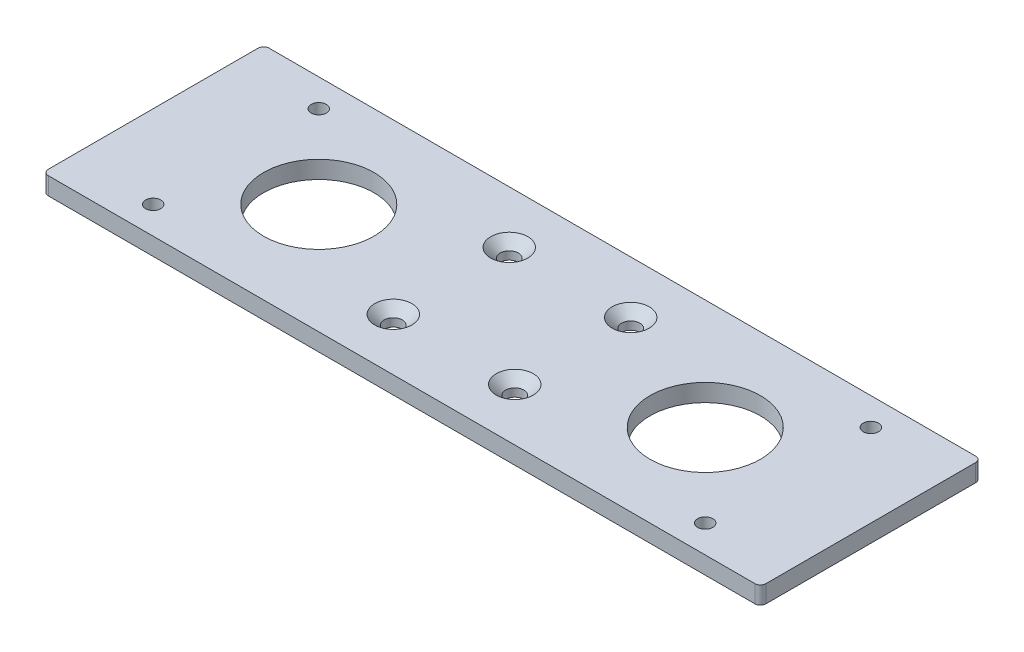
ISO-10303-21;
HEADER;
FILE_DESCRIPTION(('STEP AP214'),'2;1');
FILE_NAME('part.step','',(''),(''),'','','');
FILE_SCHEMA(('AUTOMOTIVE_DESIGN { 1 0 10303 214 1 1 1 1 }'));
ENDSEC;
DATA;
#1=APPLICATION_CONTEXT('core data for automotive mechanical design processes');
#2=APPLICATION_PROTOCOL_DEFINITION('international standard','automotive_design',2000,#1);
#3=PRODUCT_CONTEXT('',#1,'mechanical');
#4=PRODUCT('Part','Part','',(#3));
#5=PRODUCT_RELATED_PRODUCT_CATEGORY('part','',(#4));
#6=PRODUCT_DEFINITION_FORMATION('','',#4);
#7=PRODUCT_DEFINITION_CONTEXT('part definition',#1,'design');
#8=PRODUCT_DEFINITION('design','',#6,#7);
#9=PRODUCT_DEFINITION_SHAPE('','',#8);
#10=(LENGTH_UNIT() NAMED_UNIT(*) SI_UNIT(.MILLI.,.METRE.));
#11=(NAMED_UNIT(*) PLANE_ANGLE_UNIT() SI_UNIT($,.RADIAN.));
#12=(NAMED_UNIT(*) SI_UNIT($,.STERADIAN.) SOLID_ANGLE_UNIT());
#13=UNCERTAINTY_MEASURE_WITH_UNIT(LENGTH_MEASURE(1.E-05),#10,'distance_accuracy_value','');
#14=(GEOMETRIC_REPRESENTATION_CONTEXT(3) GLOBAL_UNCERTAINTY_ASSIGNED_CONTEXT((#13)) GLOBAL_UNIT_ASSIGNED_CONTEXT((#10,
#11,#12)) REPRESENTATION_CONTEXT('',''));
#15=CARTESIAN_POINT('',(0.,0.,0.));
#16=DIRECTION('',(0.,0.,1.));
#17=DIRECTION('',(1.,0.,0.));
#18=AXIS2_PLACEMENT_3D('',#15,#16,#17);
#19=CARTESIAN_POINT('',(-149.777777777778,-6.35,-34.4444444444445));
#20=DIRECTION('',(-1.,0.,0.));
#21=DIRECTION('',(0.,0.,1.));
#22=AXIS2_PLACEMENT_3D('',#19,#20,#21);
#23=PLANE('',#22);
#24=DIRECTION('',(0.,0.,1.));
#25=VECTOR('',#24,1.);
#26=CARTESIAN_POINT('',(-149.777777777778,0.,-34.4444444444445));
#27=LINE('',#26,#25);
#28=CARTESIAN_POINT('',(-149.777777777778,0.,-32.4444444444445));
#29=VERTEX_POINT('',#28);
#30=CARTESIAN_POINT('',(-149.777777777778,0.,43.5555555555555));
#31=VERTEX_POINT('',#30);
#32=EDGE_CURVE('E166',#29,#31,#27,.T.);
#33=ORIENTED_EDGE('',*,*,#32,.F.);
#34=DIRECTION('',(0.,1.,0.));
#35=VECTOR('',#34,1.);
#36=CARTESIAN_POINT('',(-149.777777777778,-6.35,-32.4444444444445));
#37=LINE('',#36,#35);
#38=CARTESIAN_POINT('',(-149.777777777778,-6.35,-32.4444444444445));
#39=VERTEX_POINT('',#38);
#40=EDGE_CURVE('E146',#29,#39,#37,.F.);
#41=ORIENTED_EDGE('',*,*,#40,.T.);
#42=DIRECTION('',(0.,0.,1.));
#43=VECTOR('',#42,1.);
#44=CARTESIAN_POINT('',(-149.777777777778,-6.35,-34.4444444444445));
#45=LINE('',#44,#43);
#46=CARTESIAN_POINT('',(-149.777777777778,-6.35,43.5555555555555));
#47=VERTEX_POINT('',#46);
#48=EDGE_CURVE('E127',#39,#47,#45,.T.);
#49=ORIENTED_EDGE('',*,*,#48,.T.);
#50=DIRECTION('',(0.,1.,0.));
#51=VECTOR('',#50,1.);
#52=CARTESIAN_POINT('',(-149.777777777778,-6.35,43.5555555555555));
#53=LINE('',#52,#51);
#54=EDGE_CURVE('E143',#47,#31,#53,.T.);
#55=ORIENTED_EDGE('',*,*,#54,.T.);
#56=EDGE_LOOP('',(#33,#41,#49,#55));
#57=FACE_BOUND('',#56,.T.);
#58=ADVANCED_FACE('F40',(#57),#23,.T.);
#59=CARTESIAN_POINT('',(-149.777777777778,-6.35,-34.4444444444445));
#60=DIRECTION('',(0.,0.,-1.));
#61=DIRECTION('',(-1.,0.,0.));
#62=AXIS2_PLACEMENT_3D('',#59,#60,#61);
#63=PLANE('',#62);
#64=DIRECTION('',(-1.,0.,0.));
#65=VECTOR('',#64,1.);
#66=CARTESIAN_POINT('',(-149.777777777778,-6.35,-34.4444444444445));
#67=LINE('',#66,#65);
#68=CARTESIAN_POINT('',(108.222222222222,-6.35,-34.4444444444445));
#69=VERTEX_POINT('',#68);
#70=CARTESIAN_POINT('',(-147.777777777778,-6.35,-34.4444444444445));
#71=VERTEX_POINT('',#70);
#72=EDGE_CURVE('E132',#69,#71,#67,.T.);
#73=ORIENTED_EDGE('',*,*,#72,.T.);
#74=DIRECTION('',(0.,1.,0.));
#75=VECTOR('',#74,1.);
#76=CARTESIAN_POINT('',(-147.777777777778,-6.35,-34.4444444444445));
#77=LINE('',#76,#75);
#78=CARTESIAN_POINT('',(-147.777777777778,0.,-34.4444444444445));
#79=VERTEX_POINT('',#78);
#80=EDGE_CURVE('E126',#71,#79,#77,.T.);
#81=ORIENTED_EDGE('',*,*,#80,.T.);
#82=DIRECTION('',(-1.,0.,0.));
#83=VECTOR('',#82,1.);
#84=CARTESIAN_POINT('',(-149.777777777778,0.,-34.4444444444445));
#85=LINE('',#84,#83);
#86=CARTESIAN_POINT('',(108.222222222222,0.,-34.4444444444445));
#87=VERTEX_POINT('',#86);
#88=EDGE_CURVE('E109',#87,#79,#85,.T.);
#89=ORIENTED_EDGE('',*,*,#88,.F.);
#90=DIRECTION('',(0.,1.,0.));
#91=VECTOR('',#90,1.);
#92=CARTESIAN_POINT('',(108.222222222222,-6.35,-34.4444444444445));
#93=LINE('',#92,#91);
#94=EDGE_CURVE('E123',#87,#69,#93,.F.);
#95=ORIENTED_EDGE('',*,*,#94,.T.);
#96=EDGE_LOOP('',(#73,#81,#89,#95));
#97=FACE_BOUND('',#96,.T.);
#98=ADVANCED_FACE('F122',(#97),#63,.T.);
#99=CARTESIAN_POINT('',(110.222222222222,-6.35,-34.4444444444445));
#100=DIRECTION('',(1.,0.,0.));
#101=DIRECTION('',(0.,0.,-1.));
#102=AXIS2_PLACEMENT_3D('',#99,#100,#101);
#103=PLANE('',#102);
#104=DIRECTION('',(0.,0.,-1.));
#105=VECTOR('',#104,1.);
#106=CARTESIAN_POINT('',(110.222222222222,-6.35,-34.4444444444445));
#107=LINE('',#106,#105);
#108=CARTESIAN_POINT('',(110.222222222222,-6.35,43.5555555555555));
#109=VERTEX_POINT('',#108);
#110=CARTESIAN_POINT('',(110.222222222222,-6.35,-32.4444444444445));
#111=VERTEX_POINT('',#110);
#112=EDGE_CURVE('E136',#109,#111,#107,.T.);
#113=ORIENTED_EDGE('',*,*,#112,.T.);
#114=DIRECTION('',(0.,1.,0.));
#115=VECTOR('',#114,1.);
#116=CARTESIAN_POINT('',(110.222222222222,-6.35,-32.4444444444445));
#117=LINE('',#116,#115);
#118=CARTESIAN_POINT('',(110.222222222222,0.,-32.4444444444445));
#119=VERTEX_POINT('',#118);
#120=EDGE_CURVE('E156',#111,#119,#117,.T.);
#121=ORIENTED_EDGE('',*,*,#120,.T.);
#122=DIRECTION('',(0.,0.,-1.));
#123=VECTOR('',#122,1.);
#124=CARTESIAN_POINT('',(110.222222222222,0.,-34.4444444444445));
#125=LINE('',#124,#123);
#126=CARTESIAN_POINT('',(110.222222222222,0.,43.5555555555555));
#127=VERTEX_POINT('',#126);
#128=EDGE_CURVE('E111',#127,#119,#125,.T.);
#129=ORIENTED_EDGE('',*,*,#128,.F.);
#130=DIRECTION('',(0.,1.,0.));
#131=VECTOR('',#130,1.);
#132=CARTESIAN_POINT('',(110.222222222222,-6.35,43.5555555555555));
#133=LINE('',#132,#131);
#134=EDGE_CURVE('E154',#127,#109,#133,.F.);
#135=ORIENTED_EDGE('',*,*,#134,.T.);
#136=EDGE_LOOP('',(#113,#121,#129,#135));
#137=FACE_BOUND('',#136,.T.);
#138=ADVANCED_FACE('F159',(#137),#103,.T.);
#139=CARTESIAN_POINT('',(-149.777777777778,-6.35,45.5555555555555));
#140=DIRECTION('',(0.,0.,1.));
#141=DIRECTION('',(1.,0.,0.));
#142=AXIS2_PLACEMENT_3D('',#139,#140,#141);
#143=PLANE('',#142);
#144=DIRECTION('',(1.,0.,0.));
#145=VECTOR('',#144,1.);
#146=CARTESIAN_POINT('',(-149.777777777778,-6.35,45.5555555555555));
#147=LINE('',#146,#145);
#148=CARTESIAN_POINT('',(-147.777777777778,-6.35,45.5555555555555));
#149=VERTEX_POINT('',#148);
#150=CARTESIAN_POINT('',(108.222222222222,-6.35,45.5555555555555));
#151=VERTEX_POINT('',#150);
#152=EDGE_CURVE('E161',#149,#151,#147,.T.);
#153=ORIENTED_EDGE('',*,*,#152,.T.);
#154=DIRECTION('',(0.,1.,0.));
#155=VECTOR('',#154,1.);
#156=CARTESIAN_POINT('',(108.222222222222,-6.35,45.5555555555555));
#157=LINE('',#156,#155);
#158=CARTESIAN_POINT('',(108.222222222222,0.,45.5555555555555));
#159=VERTEX_POINT('',#158);
#160=EDGE_CURVE('E11',#151,#159,#157,.T.);
#161=ORIENTED_EDGE('',*,*,#160,.T.);
#162=DIRECTION('',(1.,0.,0.));
#163=VECTOR('',#162,1.);
#164=CARTESIAN_POINT('',(-149.777777777778,0.,45.5555555555555));
#165=LINE('',#164,#163);
#166=CARTESIAN_POINT('',(-147.777777777778,0.,45.5555555555555));
#167=VERTEX_POINT('',#166);
#168=EDGE_CURVE('E169',#167,#159,#165,.T.);
#169=ORIENTED_EDGE('',*,*,#168,.F.);
#170=DIRECTION('',(0.,1.,0.));
#171=VECTOR('',#170,1.);
#172=CARTESIAN_POINT('',(-147.777777777778,-6.35,45.5555555555555));
#173=LINE('',#172,#171);
#174=EDGE_CURVE('E48',#167,#149,#173,.F.);
#175=ORIENTED_EDGE('',*,*,#174,.T.);
#176=EDGE_LOOP('',(#153,#161,#169,#175));
#177=FACE_BOUND('',#176,.T.);
#178=ADVANCED_FACE('F172',(#177),#143,.T.);
#179=CARTESIAN_POINT('',(0.,-6.35,0.));
#180=DIRECTION('',(0.,1.,0.));
#181=DIRECTION('',(0.,0.,1.));
#182=AXIS2_PLACEMENT_3D('',#179,#180,#181);
#183=PLANE('',#182);
#184=CARTESIAN_POINT('',(50.2222222222223,-6.35,5.55555555555558));
#185=DIRECTION('',(0.,1.,0.));
#186=DIRECTION('',(0.,0.,1.));
#187=AXIS2_PLACEMENT_3D('',#184,#185,#186);
#188=CIRCLE('',#187,20.);
#189=CARTESIAN_POINT('',(50.2222222222223,-6.35,25.5555555555556));
#190=VERTEX_POINT('',#189);
#191=EDGE_CURVE('E250',#190,#190,#188,.T.);
#192=ORIENTED_EDGE('',*,*,#191,.T.);
#193=EDGE_LOOP('',(#192));
#194=FACE_BOUND('',#193,.T.);
#195=CARTESIAN_POINT('',(-89.7777777777778,-6.35,5.55555555555557));
#196=DIRECTION('',(0.,1.,0.));
#197=DIRECTION('',(0.,0.,1.));
#198=AXIS2_PLACEMENT_3D('',#195,#196,#197);
#199=CIRCLE('',#198,20.);
#200=CARTESIAN_POINT('',(-89.7777777777778,-6.35,25.5555555555556));
#201=VERTEX_POINT('',#200);
#202=EDGE_CURVE('E244',#201,#201,#199,.T.);
#203=ORIENTED_EDGE('',*,*,#202,.T.);
#204=EDGE_LOOP('',(#203));
#205=FACE_BOUND('',#204,.T.);
#206=CARTESIAN_POINT('',(-41.7777777777778,-6.35,-15.4444444444444));
#207=DIRECTION('',(0.,1.,0.));
#208=DIRECTION('',(0.,0.,1.));
#209=AXIS2_PLACEMENT_3D('',#206,#207,#208);
#210=CIRCLE('',#209,3.3);
#211=CARTESIAN_POINT('',(-41.7777777777778,-6.35,-12.1444444444444));
#212=VERTEX_POINT('',#211);
#213=EDGE_CURVE('E235',#212,#212,#210,.T.);
#214=ORIENTED_EDGE('',*,*,#213,.T.);
#215=EDGE_LOOP('',(#214));
#216=FACE_BOUND('',#215,.T.);
#217=CARTESIAN_POINT('',(2.22222222222224,-6.35,-15.4444444444444));
#218=DIRECTION('',(0.,1.,0.));
#219=DIRECTION('',(0.,0.,1.));
#220=AXIS2_PLACEMENT_3D('',#217,#218,#219);
#221=CIRCLE('',#220,3.3);
#222=CARTESIAN_POINT('',(2.22222222222224,-6.35,-12.1444444444444));
#223=VERTEX_POINT('',#222);
#224=EDGE_CURVE('E226',#223,#223,#221,.T.);
#225=ORIENTED_EDGE('',*,*,#224,.T.);
#226=EDGE_LOOP('',(#225));
#227=FACE_BOUND('',#226,.T.);
#228=CARTESIAN_POINT('',(2.22222222222224,-6.35,26.5555555555556));
#229=DIRECTION('',(0.,1.,0.));
#230=DIRECTION('',(0.,0.,1.));
#231=AXIS2_PLACEMENT_3D('',#228,#229,#230);
#232=CIRCLE('',#231,3.3);
#233=CARTESIAN_POINT('',(2.22222222222224,-6.35,29.8555555555556));
#234=VERTEX_POINT('',#233);
#235=EDGE_CURVE('E217',#234,#234,#232,.T.);
#236=ORIENTED_EDGE('',*,*,#235,.T.);
#237=EDGE_LOOP('',(#236));
#238=FACE_BOUND('',#237,.T.);
#239=CARTESIAN_POINT('',(-41.7777777777778,-6.35,26.5555555555556));
#240=DIRECTION('',(0.,1.,0.));
#241=DIRECTION('',(0.,0.,1.));
#242=AXIS2_PLACEMENT_3D('',#239,#240,#241);
#243=CIRCLE('',#242,3.3);
#244=CARTESIAN_POINT('',(-41.7777777777778,-6.35,29.8555555555556));
#245=VERTEX_POINT('',#244);
#246=EDGE_CURVE('E208',#245,#245,#243,.T.);
#247=ORIENTED_EDGE('',*,*,#246,.T.);
#248=EDGE_LOOP('',(#247));
#249=FACE_BOUND('',#248,.T.);
#250=CARTESIAN_POINT('',(-119.777777777778,-6.35,-24.4444444444445));
#251=DIRECTION('',(0.,1.,0.));
#252=DIRECTION('',(0.,0.,1.));
#253=AXIS2_PLACEMENT_3D('',#250,#251,#252);
#254=CIRCLE('',#253,2.75);
#255=CARTESIAN_POINT('',(-119.777777777778,-6.35,-21.6944444444445));
#256=VERTEX_POINT('',#255);
#257=EDGE_CURVE('E202',#256,#256,#254,.T.);
#258=ORIENTED_EDGE('',*,*,#257,.T.);
#259=EDGE_LOOP('',(#258));
#260=FACE_BOUND('',#259,.T.);
#261=CARTESIAN_POINT('',(-119.777777777778,-6.35,35.5555555555555));
#262=DIRECTION('',(0.,1.,0.));
#263=DIRECTION('',(0.,0.,1.));
#264=AXIS2_PLACEMENT_3D('',#261,#262,#263);
#265=CIRCLE('',#264,2.75);
#266=CARTESIAN_POINT('',(-119.777777777778,-6.35,38.3055555555555));
#267=VERTEX_POINT('',#266);
#268=EDGE_CURVE('E196',#267,#267,#265,.T.);
#269=ORIENTED_EDGE('',*,*,#268,.T.);
#270=EDGE_LOOP('',(#269));
#271=FACE_BOUND('',#270,.T.);
#272=CARTESIAN_POINT('',(80.2222222222223,-6.35,35.5555555555555));
#273=DIRECTION('',(0.,1.,0.));
#274=DIRECTION('',(0.,0.,1.));
#275=AXIS2_PLACEMENT_3D('',#272,#273,#274);
#276=CIRCLE('',#275,2.75);
#277=CARTESIAN_POINT('',(80.2222222222223,-6.35,38.3055555555555));
#278=VERTEX_POINT('',#277);
#279=EDGE_CURVE('E190',#278,#278,#276,.T.);
#280=ORIENTED_EDGE('',*,*,#279,.T.);
#281=EDGE_LOOP('',(#280));
#282=FACE_BOUND('',#281,.T.);
#283=CARTESIAN_POINT('',(80.2222222222223,-6.35,-24.4444444444445));
#284=DIRECTION('',(0.,1.,0.));
#285=DIRECTION('',(0.,0.,1.));
#286=AXIS2_PLACEMENT_3D('',#283,#284,#285);
#287=CIRCLE('',#286,2.75);
#288=CARTESIAN_POINT('',(80.2222222222223,-6.35,-21.6944444444445));
#289=VERTEX_POINT('',#288);
#290=EDGE_CURVE('E170',#289,#289,#287,.T.);
#291=ORIENTED_EDGE('',*,*,#290,.T.);
#292=EDGE_LOOP('',(#291));
#293=FACE_BOUND('',#292,.T.);
#294=ORIENTED_EDGE('',*,*,#48,.F.);
#295=CARTESIAN_POINT('',(-147.777777777778,-6.35,-32.4444444444445));
#296=DIRECTION('',(0.,1.,0.));
#297=DIRECTION('',(0.,0.,1.));
#298=AXIS2_PLACEMENT_3D('',#295,#296,#297);
#299=CIRCLE('',#298,2.);
#300=EDGE_CURVE('E152',#39,#71,#299,.F.);
#301=ORIENTED_EDGE('',*,*,#300,.T.);
#302=ORIENTED_EDGE('',*,*,#72,.F.);
#303=CARTESIAN_POINT('',(108.222222222222,-6.35,-32.4444444444445));
#304=DIRECTION('',(0.,1.,0.));
#305=DIRECTION('',(0.,0.,1.));
#306=AXIS2_PLACEMENT_3D('',#303,#304,#305);
#307=CIRCLE('',#306,2.);
#308=EDGE_CURVE('E131',#69,#111,#307,.F.);
#309=ORIENTED_EDGE('',*,*,#308,.T.);
#310=ORIENTED_EDGE('',*,*,#112,.F.);
#311=CARTESIAN_POINT('',(108.222222222222,-6.35,43.5555555555555));
#312=DIRECTION('',(0.,1.,0.));
#313=DIRECTION('',(0.,0.,1.));
#314=AXIS2_PLACEMENT_3D('',#311,#312,#313);
#315=CIRCLE('',#314,2.);
#316=EDGE_CURVE('E55',#109,#151,#315,.F.);
#317=ORIENTED_EDGE('',*,*,#316,.T.);
#318=ORIENTED_EDGE('',*,*,#152,.F.);
#319=CARTESIAN_POINT('',(-147.777777777778,-6.35,43.5555555555555));
#320=DIRECTION('',(0.,1.,0.));
#321=DIRECTION('',(0.,0.,1.));
#322=AXIS2_PLACEMENT_3D('',#319,#320,#321);
#323=CIRCLE('',#322,2.);
#324=EDGE_CURVE('E148',#149,#47,#323,.F.);
#325=ORIENTED_EDGE('',*,*,#324,.T.);
#326=EDGE_LOOP('',(#294,#301,#302,#309,#310,#317,#318,#325));
#327=FACE_BOUND('',#326,.T.);
#328=ADVANCED_FACE('F179',(#194,#205,#216,#227,#238,#249,#260,#271,#282,#293,#327),#183,.F.);
#329=CARTESIAN_POINT('',(0.,0.,0.));
#330=DIRECTION('',(0.,1.,0.));
#331=DIRECTION('',(0.,0.,1.));
#332=AXIS2_PLACEMENT_3D('',#329,#330,#331);
#333=PLANE('',#332);
#334=CARTESIAN_POINT('',(50.2222222222223,0.,5.55555555555558));
#335=DIRECTION('',(0.,1.,0.));
#336=DIRECTION('',(0.,0.,1.));
#337=AXIS2_PLACEMENT_3D('',#334,#335,#336);
#338=CIRCLE('',#337,20.);
#339=CARTESIAN_POINT('',(50.2222222222223,0.,25.5555555555556));
#340=VERTEX_POINT('',#339);
#341=EDGE_CURVE('E253',#340,#340,#338,.T.);
#342=ORIENTED_EDGE('',*,*,#341,.F.);
#343=EDGE_LOOP('',(#342));
#344=FACE_BOUND('',#343,.T.);
#345=CARTESIAN_POINT('',(-89.7777777777778,0.,5.55555555555557));
#346=DIRECTION('',(0.,1.,0.));
#347=DIRECTION('',(0.,0.,1.));
#348=AXIS2_PLACEMENT_3D('',#345,#346,#347);
#349=CIRCLE('',#348,20.);
#350=CARTESIAN_POINT('',(-89.7777777777778,0.,25.5555555555556));
#351=VERTEX_POINT('',#350);
#352=EDGE_CURVE('E247',#351,#351,#349,.T.);
#353=ORIENTED_EDGE('',*,*,#352,.F.);
#354=EDGE_LOOP('',(#353));
#355=FACE_BOUND('',#354,.T.);
#356=CARTESIAN_POINT('',(-41.7777777777778,0.,-15.4444444444444));
#357=DIRECTION('',(0.,1.,0.));
#358=DIRECTION('',(0.,0.,1.));
#359=AXIS2_PLACEMENT_3D('',#356,#357,#358);
#360=CIRCLE('',#359,6.72);
#361=CARTESIAN_POINT('',(-41.7777777777778,0.,-8.72444444444442));
#362=VERTEX_POINT('',#361);
#363=EDGE_CURVE('E241',#362,#362,#360,.T.);
#364=ORIENTED_EDGE('',*,*,#363,.F.);
#365=EDGE_LOOP('',(#364));
#366=FACE_BOUND('',#365,.T.);
#367=CARTESIAN_POINT('',(2.22222222222224,0.,-15.4444444444444));
#368=DIRECTION('',(0.,1.,0.));
#369=DIRECTION('',(0.,0.,1.));
#370=AXIS2_PLACEMENT_3D('',#367,#368,#369);
#371=CIRCLE('',#370,6.72);
#372=CARTESIAN_POINT('',(2.22222222222224,0.,-8.72444444444443));
#373=VERTEX_POINT('',#372);
#374=EDGE_CURVE('E232',#373,#373,#371,.T.);
#375=ORIENTED_EDGE('',*,*,#374,.F.);
#376=EDGE_LOOP('',(#375));
#377=FACE_BOUND('',#376,.T.);
#378=CARTESIAN_POINT('',(2.22222222222224,0.,26.5555555555556));
#379=DIRECTION('',(0.,1.,0.));
#380=DIRECTION('',(0.,0.,1.));
#381=AXIS2_PLACEMENT_3D('',#378,#379,#380);
#382=CIRCLE('',#381,6.72);
#383=CARTESIAN_POINT('',(2.22222222222224,0.,33.2755555555556));
#384=VERTEX_POINT('',#383);
#385=EDGE_CURVE('E223',#384,#384,#382,.T.);
#386=ORIENTED_EDGE('',*,*,#385,.F.);
#387=EDGE_LOOP('',(#386));
#388=FACE_BOUND('',#387,.T.);
#389=CARTESIAN_POINT('',(-41.7777777777778,0.,26.5555555555556));
#390=DIRECTION('',(0.,1.,0.));
#391=DIRECTION('',(0.,0.,1.));
#392=AXIS2_PLACEMENT_3D('',#389,#390,#391);
#393=CIRCLE('',#392,6.72);
#394=CARTESIAN_POINT('',(-41.7777777777778,0.,33.2755555555556));
#395=VERTEX_POINT('',#394);
#396=EDGE_CURVE('E214',#395,#395,#393,.T.);
#397=ORIENTED_EDGE('',*,*,#396,.F.);
#398=EDGE_LOOP('',(#397));
#399=FACE_BOUND('',#398,.T.);
#400=CARTESIAN_POINT('',(-119.777777777778,0.,-24.4444444444445));
#401=DIRECTION('',(0.,1.,0.));
#402=DIRECTION('',(0.,0.,1.));
#403=AXIS2_PLACEMENT_3D('',#400,#401,#402);
#404=CIRCLE('',#403,2.75);
#405=CARTESIAN_POINT('',(-119.777777777778,0.,-21.6944444444445));
#406=VERTEX_POINT('',#405);
#407=EDGE_CURVE('E205',#406,#406,#404,.T.);
#408=ORIENTED_EDGE('',*,*,#407,.F.);
#409=EDGE_LOOP('',(#408));
#410=FACE_BOUND('',#409,.T.);
#411=CARTESIAN_POINT('',(-119.777777777778,0.,35.5555555555555));
#412=DIRECTION('',(0.,1.,0.));
#413=DIRECTION('',(0.,0.,1.));
#414=AXIS2_PLACEMENT_3D('',#411,#412,#413);
#415=CIRCLE('',#414,2.75);
#416=CARTESIAN_POINT('',(-119.777777777778,0.,38.3055555555555));
#417=VERTEX_POINT('',#416);
#418=EDGE_CURVE('E199',#417,#417,#415,.T.);
#419=ORIENTED_EDGE('',*,*,#418,.F.);
#420=EDGE_LOOP('',(#419));
#421=FACE_BOUND('',#420,.T.);
#422=CARTESIAN_POINT('',(80.2222222222223,0.,35.5555555555555));
#423=DIRECTION('',(0.,1.,0.));
#424=DIRECTION('',(0.,0.,1.));
#425=AXIS2_PLACEMENT_3D('',#422,#423,#424);
#426=CIRCLE('',#425,2.75);
#427=CARTESIAN_POINT('',(80.2222222222223,0.,38.3055555555555));
#428=VERTEX_POINT('',#427);
#429=EDGE_CURVE('E193',#428,#428,#426,.T.);
#430=ORIENTED_EDGE('',*,*,#429,.F.);
#431=EDGE_LOOP('',(#430));
#432=FACE_BOUND('',#431,.T.);
#433=CARTESIAN_POINT('',(80.2222222222223,0.,-24.4444444444445));
#434=DIRECTION('',(0.,1.,0.));
#435=DIRECTION('',(0.,0.,1.));
#436=AXIS2_PLACEMENT_3D('',#433,#434,#435);
#437=CIRCLE('',#436,2.75);
#438=CARTESIAN_POINT('',(80.2222222222223,0.,-21.6944444444445));
#439=VERTEX_POINT('',#438);
#440=EDGE_CURVE('E187',#439,#439,#437,.T.);
#441=ORIENTED_EDGE('',*,*,#440,.F.);
#442=EDGE_LOOP('',(#441));
#443=FACE_BOUND('',#442,.T.);
#444=ORIENTED_EDGE('',*,*,#88,.T.);
#445=CARTESIAN_POINT('',(-147.777777777778,0.,-32.4444444444445));
#446=DIRECTION('',(0.,1.,0.));
#447=DIRECTION('',(0.,0.,1.));
#448=AXIS2_PLACEMENT_3D('',#445,#446,#447);
#449=CIRCLE('',#448,2.);
#450=EDGE_CURVE('E116',#79,#29,#449,.T.);
#451=ORIENTED_EDGE('',*,*,#450,.T.);
#452=ORIENTED_EDGE('',*,*,#32,.T.);
#453=CARTESIAN_POINT('',(-147.777777777778,0.,43.5555555555555));
#454=DIRECTION('',(0.,1.,0.));
#455=DIRECTION('',(0.,0.,1.));
#456=AXIS2_PLACEMENT_3D('',#453,#454,#455);
#457=CIRCLE('',#456,2.);
#458=EDGE_CURVE('E134',#31,#167,#457,.T.);
#459=ORIENTED_EDGE('',*,*,#458,.T.);
#460=ORIENTED_EDGE('',*,*,#168,.T.);
#461=CARTESIAN_POINT('',(108.222222222222,0.,43.5555555555555));
#462=DIRECTION('',(0.,1.,0.));
#463=DIRECTION('',(0.,0.,1.));
#464=AXIS2_PLACEMENT_3D('',#461,#462,#463);
#465=CIRCLE('',#464,2.);
#466=EDGE_CURVE('E117',#159,#127,#465,.T.);
#467=ORIENTED_EDGE('',*,*,#466,.T.);
#468=ORIENTED_EDGE('',*,*,#128,.T.);
#469=CARTESIAN_POINT('',(108.222222222222,0.,-32.4444444444445));
#470=DIRECTION('',(0.,1.,0.));
#471=DIRECTION('',(0.,0.,1.));
#472=AXIS2_PLACEMENT_3D('',#469,#470,#471);
#473=CIRCLE('',#472,2.);
#474=EDGE_CURVE('E106',#119,#87,#473,.T.);
#475=ORIENTED_EDGE('',*,*,#474,.T.);
#476=EDGE_LOOP('',(#444,#451,#452,#459,#460,#467,#468,#475));
#477=FACE_BOUND('',#476,.T.);
#478=ADVANCED_FACE('F108',(#344,#355,#366,#377,#388,#399,#410,#421,#432,#443,#477),#333,.T.);
#479=CARTESIAN_POINT('',(-147.777777777778,-6.35,-32.4444444444445));
#480=DIRECTION('',(0.,1.,0.));
#481=DIRECTION('',(0.,0.,1.));
#482=AXIS2_PLACEMENT_3D('',#479,#480,#481);
#483=CYLINDRICAL_SURFACE('',#482,2.);
#484=ORIENTED_EDGE('',*,*,#300,.F.);
#485=ORIENTED_EDGE('',*,*,#40,.F.);
#486=ORIENTED_EDGE('',*,*,#450,.F.);
#487=ORIENTED_EDGE('',*,*,#80,.F.);
#488=EDGE_LOOP('',(#484,#485,#486,#487));
#489=FACE_BOUND('',#488,.T.);
#490=ADVANCED_FACE('F262',(#489),#483,.T.);
#491=CARTESIAN_POINT('',(108.222222222222,-6.35,-32.4444444444445));
#492=DIRECTION('',(0.,1.,0.));
#493=DIRECTION('',(0.,0.,1.));
#494=AXIS2_PLACEMENT_3D('',#491,#492,#493);
#495=CYLINDRICAL_SURFACE('',#494,2.);
#496=ORIENTED_EDGE('',*,*,#308,.F.);
#497=ORIENTED_EDGE('',*,*,#94,.F.);
#498=ORIENTED_EDGE('',*,*,#474,.F.);
#499=ORIENTED_EDGE('',*,*,#120,.F.);
#500=EDGE_LOOP('',(#496,#497,#498,#499));
#501=FACE_BOUND('',#500,.T.);
#502=ADVANCED_FACE('F130',(#501),#495,.T.);
#503=CARTESIAN_POINT('',(108.222222222222,-6.35,43.5555555555555));
#504=DIRECTION('',(0.,1.,0.));
#505=DIRECTION('',(0.,0.,1.));
#506=AXIS2_PLACEMENT_3D('',#503,#504,#505);
#507=CYLINDRICAL_SURFACE('',#506,2.);
#508=ORIENTED_EDGE('',*,*,#316,.F.);
#509=ORIENTED_EDGE('',*,*,#134,.F.);
#510=ORIENTED_EDGE('',*,*,#466,.F.);
#511=ORIENTED_EDGE('',*,*,#160,.F.);
#512=EDGE_LOOP('',(#508,#509,#510,#511));
#513=FACE_BOUND('',#512,.T.);
#514=ADVANCED_FACE('F294',(#513),#507,.T.);
#515=CARTESIAN_POINT('',(-147.777777777778,-6.35,43.5555555555555));
#516=DIRECTION('',(0.,1.,0.));
#517=DIRECTION('',(0.,0.,1.));
#518=AXIS2_PLACEMENT_3D('',#515,#516,#517);
#519=CYLINDRICAL_SURFACE('',#518,2.);
#520=ORIENTED_EDGE('',*,*,#324,.F.);
#521=ORIENTED_EDGE('',*,*,#174,.F.);
#522=ORIENTED_EDGE('',*,*,#458,.F.);
#523=ORIENTED_EDGE('',*,*,#54,.F.);
#524=EDGE_LOOP('',(#520,#521,#522,#523));
#525=FACE_BOUND('',#524,.T.);
#526=ADVANCED_FACE('F42',(#525),#519,.T.);
#527=CARTESIAN_POINT('',(80.2222222222223,0.,-24.4444444444445));
#528=DIRECTION('',(0.,1.,0.));
#529=DIRECTION('',(0.,0.,1.));
#530=AXIS2_PLACEMENT_3D('',#527,#528,#529);
#531=CYLINDRICAL_SURFACE('',#530,2.75);
#532=ORIENTED_EDGE('',*,*,#290,.F.);
#533=EDGE_LOOP('',(#532));
#534=FACE_BOUND('',#533,.T.);
#535=ORIENTED_EDGE('',*,*,#440,.T.);
#536=EDGE_LOOP('',(#535));
#537=FACE_BOUND('',#536,.T.);
#538=ADVANCED_FACE('F282',(#534,#537),#531,.F.);
#539=CARTESIAN_POINT('',(80.2222222222223,0.,35.5555555555555));
#540=DIRECTION('',(0.,1.,0.));
#541=DIRECTION('',(0.,0.,1.));
#542=AXIS2_PLACEMENT_3D('',#539,#540,#541);
#543=CYLINDRICAL_SURFACE('',#542,2.75);
#544=ORIENTED_EDGE('',*,*,#279,.F.);
#545=EDGE_LOOP('',(#544));
#546=FACE_BOUND('',#545,.T.);
#547=ORIENTED_EDGE('',*,*,#429,.T.);
#548=EDGE_LOOP('',(#547));
#549=FACE_BOUND('',#548,.T.);
#550=ADVANCED_FACE('F284',(#546,#549),#543,.F.);
#551=CARTESIAN_POINT('',(-119.777777777778,0.,35.5555555555555));
#552=DIRECTION('',(0.,1.,0.));
#553=DIRECTION('',(0.,0.,1.));
#554=AXIS2_PLACEMENT_3D('',#551,#552,#553);
#555=CYLINDRICAL_SURFACE('',#554,2.75);
#556=ORIENTED_EDGE('',*,*,#268,.F.);
#557=EDGE_LOOP('',(#556));
#558=FACE_BOUND('',#557,.T.);
#559=ORIENTED_EDGE('',*,*,#418,.T.);
#560=EDGE_LOOP('',(#559));
#561=FACE_BOUND('',#560,.T.);
#562=ADVANCED_FACE('F291',(#558,#561),#555,.F.);
#563=CARTESIAN_POINT('',(-119.777777777778,0.,-24.4444444444445));
#564=DIRECTION('',(0.,1.,0.));
#565=DIRECTION('',(0.,0.,1.));
#566=AXIS2_PLACEMENT_3D('',#563,#564,#565);
#567=CYLINDRICAL_SURFACE('',#566,2.75);
#568=ORIENTED_EDGE('',*,*,#257,.F.);
#569=EDGE_LOOP('',(#568));
#570=FACE_BOUND('',#569,.T.);
#571=ORIENTED_EDGE('',*,*,#407,.T.);
#572=EDGE_LOOP('',(#571));
#573=FACE_BOUND('',#572,.T.);
#574=ADVANCED_FACE('F339',(#570,#573),#567,.F.);
#575=CARTESIAN_POINT('',(-41.7777777777778,0.,26.5555555555556));
#576=DIRECTION('',(0.,1.,0.));
#577=DIRECTION('',(0.,0.,1.));
#578=AXIS2_PLACEMENT_3D('',#575,#576,#577);
#579=CYLINDRICAL_SURFACE('',#578,3.3);
#580=ORIENTED_EDGE('',*,*,#246,.F.);
#581=EDGE_LOOP('',(#580));
#582=FACE_BOUND('',#581,.T.);
#583=CARTESIAN_POINT('',(-41.7777777777778,-3.42,26.5555555555556));
#584=DIRECTION('',(0.,1.,0.));
#585=DIRECTION('',(0.,0.,1.));
#586=AXIS2_PLACEMENT_3D('',#583,#584,#585);
#587=CIRCLE('',#586,3.3);
#588=CARTESIAN_POINT('',(-41.7777777777778,-3.42,29.8555555555556));
#589=VERTEX_POINT('',#588);
#590=EDGE_CURVE('E211',#589,#589,#587,.T.);
#591=ORIENTED_EDGE('',*,*,#590,.T.);
#592=EDGE_LOOP('',(#591));
#593=FACE_BOUND('',#592,.T.);
#594=ADVANCED_FACE('F349',(#582,#593),#579,.F.);
#595=CARTESIAN_POINT('',(-41.7777777777778,0.,26.5555555555556));
#596=DIRECTION('',(0.,1.,0.));
#597=DIRECTION('',(0.,0.,1.));
#598=AXIS2_PLACEMENT_3D('',#595,#596,#597);
#599=CONICAL_SURFACE('',#598,6.72,0.785398163397449);
#600=ORIENTED_EDGE('',*,*,#590,.F.);
#601=EDGE_LOOP('',(#600));
#602=FACE_BOUND('',#601,.T.);
#603=ORIENTED_EDGE('',*,*,#396,.T.);
#604=EDGE_LOOP('',(#603));
#605=FACE_BOUND('',#604,.T.);
#606=ADVANCED_FACE('F359',(#602,#605),#599,.F.);
#607=CARTESIAN_POINT('',(2.22222222222224,0.,26.5555555555556));
#608=DIRECTION('',(0.,1.,0.));
#609=DIRECTION('',(0.,0.,1.));
#610=AXIS2_PLACEMENT_3D('',#607,#608,#609);
#611=CYLINDRICAL_SURFACE('',#610,3.3);
#612=ORIENTED_EDGE('',*,*,#235,.F.);
#613=EDGE_LOOP('',(#612));
#614=FACE_BOUND('',#613,.T.);
#615=CARTESIAN_POINT('',(2.22222222222224,-3.42,26.5555555555556));
#616=DIRECTION('',(0.,1.,0.));
#617=DIRECTION('',(0.,0.,1.));
#618=AXIS2_PLACEMENT_3D('',#615,#616,#617);
#619=CIRCLE('',#618,3.3);
#620=CARTESIAN_POINT('',(2.22222222222224,-3.42,29.8555555555556));
#621=VERTEX_POINT('',#620);
#622=EDGE_CURVE('E220',#621,#621,#619,.T.);
#623=ORIENTED_EDGE('',*,*,#622,.T.);
#624=EDGE_LOOP('',(#623));
#625=FACE_BOUND('',#624,.T.);
#626=ADVANCED_FACE('F369',(#614,#625),#611,.F.);
#627=CARTESIAN_POINT('',(2.22222222222224,0.,26.5555555555556));
#628=DIRECTION('',(0.,1.,0.));
#629=DIRECTION('',(0.,0.,1.));
#630=AXIS2_PLACEMENT_3D('',#627,#628,#629);
#631=CONICAL_SURFACE('',#630,6.72,0.785398163397449);
#632=ORIENTED_EDGE('',*,*,#622,.F.);
#633=EDGE_LOOP('',(#632));
#634=FACE_BOUND('',#633,.T.);
#635=ORIENTED_EDGE('',*,*,#385,.T.);
#636=EDGE_LOOP('',(#635));
#637=FACE_BOUND('',#636,.T.);
#638=ADVANCED_FACE('F379',(#634,#637),#631,.F.);
#639=CARTESIAN_POINT('',(2.22222222222224,0.,-15.4444444444444));
#640=DIRECTION('',(0.,1.,0.));
#641=DIRECTION('',(0.,0.,1.));
#642=AXIS2_PLACEMENT_3D('',#639,#640,#641);
#643=CYLINDRICAL_SURFACE('',#642,3.3);
#644=ORIENTED_EDGE('',*,*,#224,.F.);
#645=EDGE_LOOP('',(#644));
#646=FACE_BOUND('',#645,.T.);
#647=CARTESIAN_POINT('',(2.22222222222224,-3.42,-15.4444444444444));
#648=DIRECTION('',(0.,1.,0.));
#649=DIRECTION('',(0.,0.,1.));
#650=AXIS2_PLACEMENT_3D('',#647,#648,#649);
#651=CIRCLE('',#650,3.3);
#652=CARTESIAN_POINT('',(2.22222222222224,-3.42,-12.1444444444444));
#653=VERTEX_POINT('',#652);
#654=EDGE_CURVE('E229',#653,#653,#651,.T.);
#655=ORIENTED_EDGE('',*,*,#654,.T.);
#656=EDGE_LOOP('',(#655));
#657=FACE_BOUND('',#656,.T.);
#658=ADVANCED_FACE('F389',(#646,#657),#643,.F.);
#659=CARTESIAN_POINT('',(2.22222222222224,0.,-15.4444444444444));
#660=DIRECTION('',(0.,1.,0.));
#661=DIRECTION('',(0.,0.,1.));
#662=AXIS2_PLACEMENT_3D('',#659,#660,#661);
#663=CONICAL_SURFACE('',#662,6.72,0.785398163397449);
#664=ORIENTED_EDGE('',*,*,#654,.F.);
#665=EDGE_LOOP('',(#664));
#666=FACE_BOUND('',#665,.T.);
#667=ORIENTED_EDGE('',*,*,#374,.T.);
#668=EDGE_LOOP('',(#667));
#669=FACE_BOUND('',#668,.T.);
#670=ADVANCED_FACE('F399',(#666,#669),#663,.F.);
#671=CARTESIAN_POINT('',(-41.7777777777778,0.,-15.4444444444444));
#672=DIRECTION('',(0.,1.,0.));
#673=DIRECTION('',(0.,0.,1.));
#674=AXIS2_PLACEMENT_3D('',#671,#672,#673);
#675=CYLINDRICAL_SURFACE('',#674,3.3);
#676=ORIENTED_EDGE('',*,*,#213,.F.);
#677=EDGE_LOOP('',(#676));
#678=FACE_BOUND('',#677,.T.);
#679=CARTESIAN_POINT('',(-41.7777777777778,-3.42,-15.4444444444444));
#680=DIRECTION('',(0.,1.,0.));
#681=DIRECTION('',(0.,0.,1.));
#682=AXIS2_PLACEMENT_3D('',#679,#680,#681);
#683=CIRCLE('',#682,3.3);
#684=CARTESIAN_POINT('',(-41.7777777777778,-3.42,-12.1444444444444));
#685=VERTEX_POINT('',#684);
#686=EDGE_CURVE('E238',#685,#685,#683,.T.);
#687=ORIENTED_EDGE('',*,*,#686,.T.);
#688=EDGE_LOOP('',(#687));
#689=FACE_BOUND('',#688,.T.);
#690=ADVANCED_FACE('F409',(#678,#689),#675,.F.);
#691=CARTESIAN_POINT('',(-41.7777777777778,0.,-15.4444444444444));
#692=DIRECTION('',(0.,1.,0.));
#693=DIRECTION('',(0.,0.,1.));
#694=AXIS2_PLACEMENT_3D('',#691,#692,#693);
#695=CONICAL_SURFACE('',#694,6.72,0.78539816339745);
#696=ORIENTED_EDGE('',*,*,#686,.F.);
#697=EDGE_LOOP('',(#696));
#698=FACE_BOUND('',#697,.T.);
#699=ORIENTED_EDGE('',*,*,#363,.T.);
#700=EDGE_LOOP('',(#699));
#701=FACE_BOUND('',#700,.T.);
#702=ADVANCED_FACE('F419',(#698,#701),#695,.F.);
#703=CARTESIAN_POINT('',(-89.7777777777778,-10.,5.55555555555557));
#704=DIRECTION('',(0.,1.,0.));
#705=DIRECTION('',(0.,0.,1.));
#706=AXIS2_PLACEMENT_3D('',#703,#704,#705);
#707=CYLINDRICAL_SURFACE('',#706,20.);
#708=ORIENTED_EDGE('',*,*,#352,.T.);
#709=EDGE_LOOP('',(#708));
#710=FACE_BOUND('',#709,.T.);
#711=ORIENTED_EDGE('',*,*,#202,.F.);
#712=EDGE_LOOP('',(#711));
#713=FACE_BOUND('',#712,.T.);
#714=ADVANCED_FACE('F429',(#710,#713),#707,.F.);
#715=CARTESIAN_POINT('',(50.2222222222223,-10.,5.55555555555558));
#716=DIRECTION('',(0.,1.,0.));
#717=DIRECTION('',(0.,0.,1.));
#718=AXIS2_PLACEMENT_3D('',#715,#716,#717);
#719=CYLINDRICAL_SURFACE('',#718,20.);
#720=ORIENTED_EDGE('',*,*,#341,.T.);
#721=EDGE_LOOP('',(#720));
#722=FACE_BOUND('',#721,.T.);
#723=ORIENTED_EDGE('',*,*,#191,.F.);
#724=EDGE_LOOP('',(#723));
#725=FACE_BOUND('',#724,.T.);
#726=ADVANCED_FACE('F257',(#722,#725),#719,.F.);
#727=CLOSED_SHELL('',(#58,#98,#138,#178,#328,#478,#490,#502,#514,#526,#538,#550,#562,#574,#594,
#606,#626,#638,#658,#670,#690,#702,#714,#726));
#728=MANIFOLD_SOLID_BREP('B2',#727);
#729=ADVANCED_BREP_SHAPE_REPRESENTATION('',(#18,#728),#14);
#730=SHAPE_DEFINITION_REPRESENTATION(#9,#729);
ENDSEC;
END-ISO-10303-21;
